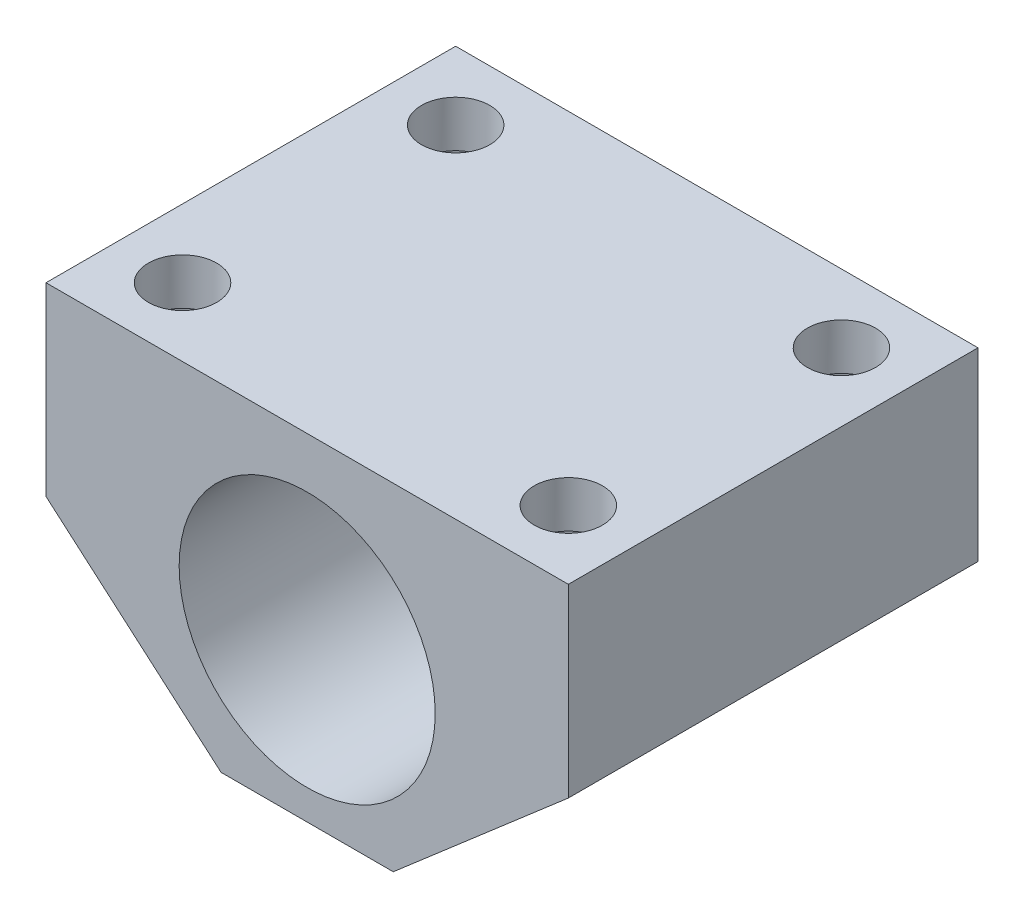
ISO-10303-21;
HEADER;
FILE_DESCRIPTION(('STEP AP214'),'2;1');
FILE_NAME('part.step','',(''),(''),'','','');
FILE_SCHEMA(('AUTOMOTIVE_DESIGN { 1 0 10303 214 1 1 1 1 }'));
ENDSEC;
DATA;
#1=APPLICATION_CONTEXT('core data for automotive mechanical design processes');
#2=APPLICATION_PROTOCOL_DEFINITION('international standard','automotive_design',2000,#1);
#3=PRODUCT_CONTEXT('',#1,'mechanical');
#4=PRODUCT('Part','Part','',(#3));
#5=PRODUCT_RELATED_PRODUCT_CATEGORY('part','',(#4));
#6=PRODUCT_DEFINITION_FORMATION('','',#4);
#7=PRODUCT_DEFINITION_CONTEXT('part definition',#1,'design');
#8=PRODUCT_DEFINITION('design','',#6,#7);
#9=PRODUCT_DEFINITION_SHAPE('','',#8);
#10=(LENGTH_UNIT() NAMED_UNIT(*) SI_UNIT(.MILLI.,.METRE.));
#11=(NAMED_UNIT(*) PLANE_ANGLE_UNIT() SI_UNIT($,.RADIAN.));
#12=(NAMED_UNIT(*) SI_UNIT($,.STERADIAN.) SOLID_ANGLE_UNIT());
#13=UNCERTAINTY_MEASURE_WITH_UNIT(LENGTH_MEASURE(1.E-05),#10,'distance_accuracy_value','');
#14=(GEOMETRIC_REPRESENTATION_CONTEXT(3) GLOBAL_UNCERTAINTY_ASSIGNED_CONTEXT((#13)) GLOBAL_UNIT_ASSIGNED_CONTEXT((#10,
#11,#12)) REPRESENTATION_CONTEXT('',''));
#15=CARTESIAN_POINT('',(0.,0.,0.));
#16=DIRECTION('',(0.,0.,1.));
#17=DIRECTION('',(1.,0.,0.));
#18=AXIS2_PLACEMENT_3D('',#15,#16,#17);
#19=CARTESIAN_POINT('',(-11.3009689771907,-9.24783839280759,-8.));
#20=DIRECTION('',(0.,1.,0.));
#21=DIRECTION('',(0.,0.,1.));
#22=AXIS2_PLACEMENT_3D('',#19,#20,#21);
#23=CYLINDRICAL_SURFACE('',#22,2.);
#24=CARTESIAN_POINT('',(-11.3009689771907,10.4668716354959,-8.));
#25=DIRECTION('',(0.,1.,0.));
#26=DIRECTION('',(0.,0.,1.));
#27=AXIS2_PLACEMENT_3D('',#24,#25,#26);
#28=CIRCLE('',#27,2.);
#29=CARTESIAN_POINT('',(-11.3009689771907,10.4668716354959,-6.));
#30=VERTEX_POINT('',#29);
#31=EDGE_CURVE('E126',#30,#30,#28,.T.);
#32=ORIENTED_EDGE('',*,*,#31,.T.);
#33=EDGE_LOOP('',(#32));
#34=FACE_BOUND('',#33,.T.);
#35=CARTESIAN_POINT('',(-11.3009689771907,7.75216160719241,-8.));
#36=DIRECTION('',(0.,-1.,0.));
#37=DIRECTION('',(0.,0.,-1.));
#38=AXIS2_PLACEMENT_3D('',#35,#36,#37);
#39=CIRCLE('',#38,2.);
#40=CARTESIAN_POINT('',(-11.3009689771907,7.75216160719241,-10.));
#41=VERTEX_POINT('',#40);
#42=EDGE_CURVE('E153',#41,#41,#39,.F.);
#43=ORIENTED_EDGE('',*,*,#42,.F.);
#44=EDGE_LOOP('',(#43));
#45=FACE_BOUND('',#44,.T.);
#46=ADVANCED_FACE('F35',(#34,#45),#23,.F.);
#47=CARTESIAN_POINT('',(-11.3009689771907,-9.24783839280759,8.));
#48=DIRECTION('',(0.,1.,0.));
#49=DIRECTION('',(0.,0.,1.));
#50=AXIS2_PLACEMENT_3D('',#47,#48,#49);
#51=CYLINDRICAL_SURFACE('',#50,2.);
#52=CARTESIAN_POINT('',(-11.3009689771907,10.4668716354959,8.));
#53=DIRECTION('',(0.,1.,0.));
#54=DIRECTION('',(0.,0.,1.));
#55=AXIS2_PLACEMENT_3D('',#52,#53,#54);
#56=CIRCLE('',#55,2.);
#57=CARTESIAN_POINT('',(-11.3009689771907,10.4668716354959,10.));
#58=VERTEX_POINT('',#57);
#59=EDGE_CURVE('E175',#58,#58,#56,.T.);
#60=ORIENTED_EDGE('',*,*,#59,.T.);
#61=EDGE_LOOP('',(#60));
#62=FACE_BOUND('',#61,.T.);
#63=CARTESIAN_POINT('',(-11.3009689771907,7.75216160719241,8.));
#64=DIRECTION('',(0.,-1.,0.));
#65=DIRECTION('',(0.,0.,-1.));
#66=AXIS2_PLACEMENT_3D('',#63,#64,#65);
#67=CIRCLE('',#66,2.);
#68=CARTESIAN_POINT('',(-11.3009689771907,7.75216160719241,6.));
#69=VERTEX_POINT('',#68);
#70=EDGE_CURVE('E150',#69,#69,#67,.F.);
#71=ORIENTED_EDGE('',*,*,#70,.F.);
#72=EDGE_LOOP('',(#71));
#73=FACE_BOUND('',#72,.T.);
#74=ADVANCED_FACE('F208',(#62,#73),#51,.F.);
#75=CARTESIAN_POINT('',(11.3009689771907,-9.24783839280759,8.));
#76=DIRECTION('',(0.,1.,0.));
#77=DIRECTION('',(0.,0.,1.));
#78=AXIS2_PLACEMENT_3D('',#75,#76,#77);
#79=CYLINDRICAL_SURFACE('',#78,2.);
#80=CARTESIAN_POINT('',(11.3009689771907,10.4668716354959,8.));
#81=DIRECTION('',(0.,1.,0.));
#82=DIRECTION('',(0.,0.,1.));
#83=AXIS2_PLACEMENT_3D('',#80,#81,#82);
#84=CIRCLE('',#83,2.);
#85=CARTESIAN_POINT('',(11.3009689771907,10.4668716354959,10.));
#86=VERTEX_POINT('',#85);
#87=EDGE_CURVE('E170',#86,#86,#84,.T.);
#88=ORIENTED_EDGE('',*,*,#87,.T.);
#89=EDGE_LOOP('',(#88));
#90=FACE_BOUND('',#89,.T.);
#91=CARTESIAN_POINT('',(11.3009689771907,7.75216160719241,8.));
#92=DIRECTION('',(0.,-1.,0.));
#93=DIRECTION('',(0.,0.,-1.));
#94=AXIS2_PLACEMENT_3D('',#91,#92,#93);
#95=CIRCLE('',#94,2.);
#96=CARTESIAN_POINT('',(11.3009689771907,7.75216160719241,6.));
#97=VERTEX_POINT('',#96);
#98=EDGE_CURVE('E146',#97,#97,#95,.F.);
#99=ORIENTED_EDGE('',*,*,#98,.F.);
#100=EDGE_LOOP('',(#99));
#101=FACE_BOUND('',#100,.T.);
#102=ADVANCED_FACE('F214',(#90,#101),#79,.F.);
#103=CARTESIAN_POINT('',(11.3009689771907,-9.24783839280759,-8.));
#104=DIRECTION('',(0.,1.,0.));
#105=DIRECTION('',(0.,0.,1.));
#106=AXIS2_PLACEMENT_3D('',#103,#104,#105);
#107=CYLINDRICAL_SURFACE('',#106,2.);
#108=CARTESIAN_POINT('',(11.3009689771907,10.4668716354959,-8.));
#109=DIRECTION('',(0.,1.,0.));
#110=DIRECTION('',(0.,0.,1.));
#111=AXIS2_PLACEMENT_3D('',#108,#109,#110);
#112=CIRCLE('',#111,2.);
#113=CARTESIAN_POINT('',(11.3009689771907,10.4668716354959,-6.));
#114=VERTEX_POINT('',#113);
#115=EDGE_CURVE('E166',#114,#114,#112,.T.);
#116=ORIENTED_EDGE('',*,*,#115,.T.);
#117=EDGE_LOOP('',(#116));
#118=FACE_BOUND('',#117,.T.);
#119=CARTESIAN_POINT('',(11.3009689771907,7.75216160719241,-8.));
#120=DIRECTION('',(0.,-1.,0.));
#121=DIRECTION('',(0.,0.,-1.));
#122=AXIS2_PLACEMENT_3D('',#119,#120,#121);
#123=CIRCLE('',#122,2.);
#124=CARTESIAN_POINT('',(11.3009689771907,7.75216160719241,-10.));
#125=VERTEX_POINT('',#124);
#126=EDGE_CURVE('E143',#125,#125,#123,.F.);
#127=ORIENTED_EDGE('',*,*,#126,.F.);
#128=EDGE_LOOP('',(#127));
#129=FACE_BOUND('',#128,.T.);
#130=ADVANCED_FACE('F219',(#118,#129),#107,.F.);
#131=CARTESIAN_POINT('',(-6.73373151994972,-7.78687436430205,12.));
#132=DIRECTION('',(0.654103999858189,0.756404625428427,0.));
#133=DIRECTION('',(-0.756404625428427,0.654103999858189,0.));
#134=AXIS2_PLACEMENT_3D('',#131,#132,#133);
#135=PLANE('',#134);
#136=CARTESIAN_POINT('',(-11.3009689771907,-3.83733705496657,8.));
#137=DIRECTION('',(0.654103999858189,0.756404625428427,0.));
#138=DIRECTION('',(0.756404625428427,-0.654103999858189,0.));
#139=AXIS2_PLACEMENT_3D('',#136,#137,#138);
#140=ELLIPSE('',#139,4.8915618382216,3.7);
#141=CARTESIAN_POINT('',(-7.60096897719075,-7.03692721890099,8.));
#142=VERTEX_POINT('',#141);
#143=EDGE_CURVE('E39',#142,#142,#140,.T.);
#144=ORIENTED_EDGE('',*,*,#143,.T.);
#145=EDGE_LOOP('',(#144));
#146=FACE_BOUND('',#145,.T.);
#147=CARTESIAN_POINT('',(-11.3009689771907,-3.83733705496657,-8.));
#148=DIRECTION('',(0.654103999858189,0.756404625428427,0.));
#149=DIRECTION('',(0.756404625428427,-0.654103999858189,0.));
#150=AXIS2_PLACEMENT_3D('',#147,#148,#149);
#151=ELLIPSE('',#150,4.8915618382216,3.7);
#152=CARTESIAN_POINT('',(-7.60096897719075,-7.03692721890099,-8.));
#153=VERTEX_POINT('',#152);
#154=EDGE_CURVE('E161',#153,#153,#151,.T.);
#155=ORIENTED_EDGE('',*,*,#154,.T.);
#156=EDGE_LOOP('',(#155));
#157=FACE_BOUND('',#156,.T.);
#158=DIRECTION('',(0.756404625428427,-0.654103999858188,0.));
#159=VECTOR('',#158,1.);
#160=CARTESIAN_POINT('',(-6.73373151994972,-7.78687436430205,-12.));
#161=LINE('',#160,#159);
#162=CARTESIAN_POINT('',(-15.3009689771907,-0.378320661523948,-12.));
#163=VERTEX_POINT('',#162);
#164=CARTESIAN_POINT('',(-5.04427548698596,-9.24783839280759,-12.));
#165=VERTEX_POINT('',#164);
#166=EDGE_CURVE('E125',#163,#165,#161,.T.);
#167=ORIENTED_EDGE('',*,*,#166,.T.);
#168=DIRECTION('',(0.,0.,-1.));
#169=VECTOR('',#168,1.);
#170=CARTESIAN_POINT('',(-5.04427548698596,-9.24783839280759,12.));
#171=LINE('',#170,#169);
#172=CARTESIAN_POINT('',(-5.04427548698596,-9.24783839280759,12.));
#173=VERTEX_POINT('',#172);
#174=EDGE_CURVE('E11',#173,#165,#171,.T.);
#175=ORIENTED_EDGE('',*,*,#174,.F.);
#176=DIRECTION('',(0.756404625428427,-0.654103999858188,0.));
#177=VECTOR('',#176,1.);
#178=CARTESIAN_POINT('',(-6.73373151994972,-7.78687436430205,12.));
#179=LINE('',#178,#177);
#180=CARTESIAN_POINT('',(-15.3009689771907,-0.378320661523948,12.));
#181=VERTEX_POINT('',#180);
#182=EDGE_CURVE('E183',#181,#173,#179,.T.);
#183=ORIENTED_EDGE('',*,*,#182,.F.);
#184=DIRECTION('',(0.,0.,-1.));
#185=VECTOR('',#184,1.);
#186=CARTESIAN_POINT('',(-15.3009689771907,-0.378320661523948,12.));
#187=LINE('',#186,#185);
#188=EDGE_CURVE('E121',#181,#163,#187,.T.);
#189=ORIENTED_EDGE('',*,*,#188,.T.);
#190=EDGE_LOOP('',(#167,#175,#183,#189));
#191=FACE_BOUND('',#190,.T.);
#192=ADVANCED_FACE('F194',(#146,#157,#191),#135,.F.);
#193=CARTESIAN_POINT('',(0.,-9.24783839280759,12.));
#194=DIRECTION('',(0.,1.,0.));
#195=DIRECTION('',(0.,0.,1.));
#196=AXIS2_PLACEMENT_3D('',#193,#194,#195);
#197=PLANE('',#196);
#198=DIRECTION('',(1.,0.,0.));
#199=VECTOR('',#198,1.);
#200=CARTESIAN_POINT('',(0.,-9.24783839280759,-12.));
#201=LINE('',#200,#199);
#202=CARTESIAN_POINT('',(5.04427548698596,-9.24783839280759,-12.));
#203=VERTEX_POINT('',#202);
#204=EDGE_CURVE('E129',#165,#203,#201,.T.);
#205=ORIENTED_EDGE('',*,*,#204,.T.);
#206=DIRECTION('',(0.,0.,-1.));
#207=VECTOR('',#206,1.);
#208=CARTESIAN_POINT('',(5.04427548698596,-9.24783839280759,12.));
#209=LINE('',#208,#207);
#210=CARTESIAN_POINT('',(5.04427548698596,-9.24783839280759,12.));
#211=VERTEX_POINT('',#210);
#212=EDGE_CURVE('E45',#211,#203,#209,.T.);
#213=ORIENTED_EDGE('',*,*,#212,.F.);
#214=DIRECTION('',(1.,0.,0.));
#215=VECTOR('',#214,1.);
#216=CARTESIAN_POINT('',(0.,-9.24783839280759,12.));
#217=LINE('',#216,#215);
#218=EDGE_CURVE('E90',#173,#211,#217,.T.);
#219=ORIENTED_EDGE('',*,*,#218,.F.);
#220=ORIENTED_EDGE('',*,*,#174,.T.);
#221=EDGE_LOOP('',(#205,#213,#219,#220));
#222=FACE_BOUND('',#221,.T.);
#223=ADVANCED_FACE('F186',(#222),#197,.F.);
#224=CARTESIAN_POINT('',(6.73373151994972,-7.78687436430205,12.));
#225=DIRECTION('',(0.654103999858188,-0.756404625428427,0.));
#226=DIRECTION('',(0.756404625428427,0.654103999858189,0.));
#227=AXIS2_PLACEMENT_3D('',#224,#225,#226);
#228=PLANE('',#227);
#229=CARTESIAN_POINT('',(11.3009689771907,-3.83733705496657,-8.));
#230=DIRECTION('',(0.654103999858188,-0.756404625428427,0.));
#231=DIRECTION('',(-0.756404625428427,-0.654103999858189,0.));
#232=AXIS2_PLACEMENT_3D('',#229,#230,#231);
#233=ELLIPSE('',#232,4.8915618382216,3.7);
#234=CARTESIAN_POINT('',(7.60096897719074,-7.03692721890099,-8.));
#235=VERTEX_POINT('',#234);
#236=EDGE_CURVE('E159',#235,#235,#233,.T.);
#237=ORIENTED_EDGE('',*,*,#236,.F.);
#238=EDGE_LOOP('',(#237));
#239=FACE_BOUND('',#238,.T.);
#240=CARTESIAN_POINT('',(11.3009689771907,-3.83733705496657,8.));
#241=DIRECTION('',(0.654103999858188,-0.756404625428427,0.));
#242=DIRECTION('',(-0.756404625428427,-0.654103999858189,0.));
#243=AXIS2_PLACEMENT_3D('',#240,#241,#242);
#244=ELLIPSE('',#243,4.8915618382216,3.7);
#245=CARTESIAN_POINT('',(7.60096897719074,-7.03692721890099,8.));
#246=VERTEX_POINT('',#245);
#247=EDGE_CURVE('E156',#246,#246,#244,.T.);
#248=ORIENTED_EDGE('',*,*,#247,.F.);
#249=EDGE_LOOP('',(#248));
#250=FACE_BOUND('',#249,.T.);
#251=DIRECTION('',(-0.756404625428427,-0.654103999858189,0.));
#252=VECTOR('',#251,1.);
#253=CARTESIAN_POINT('',(6.73373151994972,-7.78687436430205,-12.));
#254=LINE('',#253,#252);
#255=CARTESIAN_POINT('',(15.3009689771907,-0.378320661523949,-12.));
#256=VERTEX_POINT('',#255);
#257=EDGE_CURVE('E132',#256,#203,#254,.T.);
#258=ORIENTED_EDGE('',*,*,#257,.F.);
#259=DIRECTION('',(0.,0.,-1.));
#260=VECTOR('',#259,1.);
#261=CARTESIAN_POINT('',(15.3009689771907,-0.378320661523949,12.));
#262=LINE('',#261,#260);
#263=CARTESIAN_POINT('',(15.3009689771907,-0.378320661523949,12.));
#264=VERTEX_POINT('',#263);
#265=EDGE_CURVE('E106',#264,#256,#262,.T.);
#266=ORIENTED_EDGE('',*,*,#265,.F.);
#267=DIRECTION('',(-0.756404625428427,-0.654103999858189,0.));
#268=VECTOR('',#267,1.);
#269=CARTESIAN_POINT('',(6.73373151994972,-7.78687436430205,12.));
#270=LINE('',#269,#268);
#271=EDGE_CURVE('E115',#264,#211,#270,.T.);
#272=ORIENTED_EDGE('',*,*,#271,.T.);
#273=ORIENTED_EDGE('',*,*,#212,.T.);
#274=EDGE_LOOP('',(#258,#266,#272,#273));
#275=FACE_BOUND('',#274,.T.);
#276=ADVANCED_FACE('F189',(#239,#250,#275),#228,.T.);
#277=CARTESIAN_POINT('',(15.3009689771907,0.,12.));
#278=DIRECTION('',(1.,0.,0.));
#279=DIRECTION('',(0.,0.,-1.));
#280=AXIS2_PLACEMENT_3D('',#277,#278,#279);
#281=PLANE('',#280);
#282=DIRECTION('',(0.,-1.,0.));
#283=VECTOR('',#282,1.);
#284=CARTESIAN_POINT('',(15.3009689771907,0.,-12.));
#285=LINE('',#284,#283);
#286=CARTESIAN_POINT('',(15.3009689771907,10.4668716354959,-12.));
#287=VERTEX_POINT('',#286);
#288=EDGE_CURVE('E105',#287,#256,#285,.T.);
#289=ORIENTED_EDGE('',*,*,#288,.F.);
#290=DIRECTION('',(0.,0.,-1.));
#291=VECTOR('',#290,1.);
#292=CARTESIAN_POINT('',(15.3009689771907,10.4668716354959,12.));
#293=LINE('',#292,#291);
#294=CARTESIAN_POINT('',(15.3009689771907,10.4668716354959,12.));
#295=VERTEX_POINT('',#294);
#296=EDGE_CURVE('E99',#295,#287,#293,.T.);
#297=ORIENTED_EDGE('',*,*,#296,.F.);
#298=DIRECTION('',(0.,-1.,0.));
#299=VECTOR('',#298,1.);
#300=CARTESIAN_POINT('',(15.3009689771907,0.,12.));
#301=LINE('',#300,#299);
#302=EDGE_CURVE('E103',#295,#264,#301,.T.);
#303=ORIENTED_EDGE('',*,*,#302,.T.);
#304=ORIENTED_EDGE('',*,*,#265,.T.);
#305=EDGE_LOOP('',(#289,#297,#303,#304));
#306=FACE_BOUND('',#305,.T.);
#307=ADVANCED_FACE('F101',(#306),#281,.T.);
#308=CARTESIAN_POINT('',(0.,10.4668716354959,12.));
#309=DIRECTION('',(0.,-1.,0.));
#310=DIRECTION('',(0.,0.,-1.));
#311=AXIS2_PLACEMENT_3D('',#308,#309,#310);
#312=PLANE('',#311);
#313=ORIENTED_EDGE('',*,*,#115,.F.);
#314=EDGE_LOOP('',(#313));
#315=FACE_BOUND('',#314,.T.);
#316=ORIENTED_EDGE('',*,*,#87,.F.);
#317=EDGE_LOOP('',(#316));
#318=FACE_BOUND('',#317,.T.);
#319=ORIENTED_EDGE('',*,*,#59,.F.);
#320=EDGE_LOOP('',(#319));
#321=FACE_BOUND('',#320,.T.);
#322=ORIENTED_EDGE('',*,*,#31,.F.);
#323=EDGE_LOOP('',(#322));
#324=FACE_BOUND('',#323,.T.);
#325=DIRECTION('',(-1.,0.,0.));
#326=VECTOR('',#325,1.);
#327=CARTESIAN_POINT('',(0.,10.4668716354959,-12.));
#328=LINE('',#327,#326);
#329=CARTESIAN_POINT('',(-15.3009689771907,10.4668716354959,-12.));
#330=VERTEX_POINT('',#329);
#331=EDGE_CURVE('E76',#287,#330,#328,.T.);
#332=ORIENTED_EDGE('',*,*,#331,.T.);
#333=DIRECTION('',(0.,0.,-1.));
#334=VECTOR('',#333,1.);
#335=CARTESIAN_POINT('',(-15.3009689771907,10.4668716354959,12.));
#336=LINE('',#335,#334);
#337=CARTESIAN_POINT('',(-15.3009689771907,10.4668716354959,12.));
#338=VERTEX_POINT('',#337);
#339=EDGE_CURVE('E107',#338,#330,#336,.T.);
#340=ORIENTED_EDGE('',*,*,#339,.F.);
#341=DIRECTION('',(-1.,0.,0.));
#342=VECTOR('',#341,1.);
#343=CARTESIAN_POINT('',(0.,10.4668716354959,12.));
#344=LINE('',#343,#342);
#345=EDGE_CURVE('E109',#295,#338,#344,.T.);
#346=ORIENTED_EDGE('',*,*,#345,.F.);
#347=ORIENTED_EDGE('',*,*,#296,.T.);
#348=EDGE_LOOP('',(#332,#340,#346,#347));
#349=FACE_BOUND('',#348,.T.);
#350=ADVANCED_FACE('F110',(#315,#318,#321,#324,#349),#312,.F.);
#351=CARTESIAN_POINT('',(0.,0.,12.));
#352=DIRECTION('',(0.,0.,-1.));
#353=DIRECTION('',(-1.,0.,0.));
#354=AXIS2_PLACEMENT_3D('',#351,#352,#353);
#355=CYLINDRICAL_SURFACE('',#354,7.5);
#356=CARTESIAN_POINT('',(0.,0.,12.));
#357=DIRECTION('',(0.,0.,1.));
#358=DIRECTION('',(1.,0.,0.));
#359=AXIS2_PLACEMENT_3D('',#356,#357,#358);
#360=CIRCLE('',#359,7.5);
#361=CARTESIAN_POINT('',(7.5,0.,12.));
#362=VERTEX_POINT('',#361);
#363=EDGE_CURVE('E138',#362,#362,#360,.T.);
#364=ORIENTED_EDGE('',*,*,#363,.T.);
#365=EDGE_LOOP('',(#364));
#366=FACE_BOUND('',#365,.T.);
#367=CARTESIAN_POINT('',(0.,0.,-12.));
#368=DIRECTION('',(0.,0.,1.));
#369=DIRECTION('',(1.,0.,0.));
#370=AXIS2_PLACEMENT_3D('',#367,#368,#369);
#371=CIRCLE('',#370,7.5);
#372=CARTESIAN_POINT('',(7.5,0.,-12.));
#373=VERTEX_POINT('',#372);
#374=EDGE_CURVE('E122',#373,#373,#371,.T.);
#375=ORIENTED_EDGE('',*,*,#374,.F.);
#376=EDGE_LOOP('',(#375));
#377=FACE_BOUND('',#376,.T.);
#378=ADVANCED_FACE('F37',(#366,#377),#355,.F.);
#379=CARTESIAN_POINT('',(-15.3009689771907,0.,12.));
#380=DIRECTION('',(1.,0.,0.));
#381=DIRECTION('',(0.,0.,-1.));
#382=AXIS2_PLACEMENT_3D('',#379,#380,#381);
#383=PLANE('',#382);
#384=DIRECTION('',(0.,-1.,0.));
#385=VECTOR('',#384,1.);
#386=CARTESIAN_POINT('',(-15.3009689771907,0.,-12.));
#387=LINE('',#386,#385);
#388=EDGE_CURVE('E82',#330,#163,#387,.T.);
#389=ORIENTED_EDGE('',*,*,#388,.T.);
#390=ORIENTED_EDGE('',*,*,#188,.F.);
#391=DIRECTION('',(0.,-1.,0.));
#392=VECTOR('',#391,1.);
#393=CARTESIAN_POINT('',(-15.3009689771907,0.,12.));
#394=LINE('',#393,#392);
#395=EDGE_CURVE('E54',#338,#181,#394,.T.);
#396=ORIENTED_EDGE('',*,*,#395,.F.);
#397=ORIENTED_EDGE('',*,*,#339,.T.);
#398=EDGE_LOOP('',(#389,#390,#396,#397));
#399=FACE_BOUND('',#398,.T.);
#400=ADVANCED_FACE('F195',(#399),#383,.F.);
#401=CARTESIAN_POINT('',(0.,0.,12.));
#402=DIRECTION('',(0.,0.,1.));
#403=DIRECTION('',(1.,0.,0.));
#404=AXIS2_PLACEMENT_3D('',#401,#402,#403);
#405=PLANE('',#404);
#406=ORIENTED_EDGE('',*,*,#363,.F.);
#407=EDGE_LOOP('',(#406));
#408=FACE_BOUND('',#407,.T.);
#409=ORIENTED_EDGE('',*,*,#182,.T.);
#410=ORIENTED_EDGE('',*,*,#218,.T.);
#411=ORIENTED_EDGE('',*,*,#271,.F.);
#412=ORIENTED_EDGE('',*,*,#302,.F.);
#413=ORIENTED_EDGE('',*,*,#345,.T.);
#414=ORIENTED_EDGE('',*,*,#395,.T.);
#415=EDGE_LOOP('',(#409,#410,#411,#412,#413,#414));
#416=FACE_BOUND('',#415,.T.);
#417=ADVANCED_FACE('F113',(#408,#416),#405,.T.);
#418=CARTESIAN_POINT('',(0.,0.,-12.));
#419=DIRECTION('',(0.,0.,1.));
#420=DIRECTION('',(1.,0.,0.));
#421=AXIS2_PLACEMENT_3D('',#418,#419,#420);
#422=PLANE('',#421);
#423=ORIENTED_EDGE('',*,*,#374,.T.);
#424=EDGE_LOOP('',(#423));
#425=FACE_BOUND('',#424,.T.);
#426=ORIENTED_EDGE('',*,*,#166,.F.);
#427=ORIENTED_EDGE('',*,*,#388,.F.);
#428=ORIENTED_EDGE('',*,*,#331,.F.);
#429=ORIENTED_EDGE('',*,*,#288,.T.);
#430=ORIENTED_EDGE('',*,*,#257,.T.);
#431=ORIENTED_EDGE('',*,*,#204,.F.);
#432=EDGE_LOOP('',(#426,#427,#428,#429,#430,#431));
#433=FACE_BOUND('',#432,.T.);
#434=ADVANCED_FACE('F192',(#425,#433),#422,.F.);
#435=CARTESIAN_POINT('',(11.3009689771907,7.7521616071924,-8.));
#436=DIRECTION('',(0.,-1.,0.));
#437=DIRECTION('',(0.,0.,-1.));
#438=AXIS2_PLACEMENT_3D('',#435,#436,#437);
#439=PLANE('',#438);
#440=CARTESIAN_POINT('',(11.3009689771907,7.7521616071924,-8.));
#441=DIRECTION('',(0.,-1.,0.));
#442=DIRECTION('',(0.,0.,-1.));
#443=AXIS2_PLACEMENT_3D('',#440,#441,#442);
#444=CIRCLE('',#443,3.7);
#445=CARTESIAN_POINT('',(11.3009689771907,7.7521616071924,-11.7));
#446=VERTEX_POINT('',#445);
#447=EDGE_CURVE('E278',#446,#446,#444,.T.);
#448=ORIENTED_EDGE('',*,*,#447,.T.);
#449=EDGE_LOOP('',(#448));
#450=FACE_BOUND('',#449,.T.);
#451=ORIENTED_EDGE('',*,*,#126,.T.);
#452=EDGE_LOOP('',(#451));
#453=FACE_BOUND('',#452,.T.);
#454=ADVANCED_FACE('F222',(#450,#453),#439,.T.);
#455=CARTESIAN_POINT('',(11.3009689771907,7.7521616071924,-8.));
#456=DIRECTION('',(0.,-1.,0.));
#457=DIRECTION('',(0.,0.,-1.));
#458=AXIS2_PLACEMENT_3D('',#455,#456,#457);
#459=CYLINDRICAL_SURFACE('',#458,3.7);
#460=ORIENTED_EDGE('',*,*,#236,.T.);
#461=EDGE_LOOP('',(#460));
#462=FACE_BOUND('',#461,.T.);
#463=ORIENTED_EDGE('',*,*,#447,.F.);
#464=EDGE_LOOP('',(#463));
#465=FACE_BOUND('',#464,.T.);
#466=ADVANCED_FACE('F227',(#462,#465),#459,.F.);
#467=CARTESIAN_POINT('',(11.3009689771907,7.7521616071924,8.));
#468=DIRECTION('',(0.,-1.,0.));
#469=DIRECTION('',(0.,0.,-1.));
#470=AXIS2_PLACEMENT_3D('',#467,#468,#469);
#471=PLANE('',#470);
#472=CARTESIAN_POINT('',(11.3009689771907,7.7521616071924,8.));
#473=DIRECTION('',(0.,-1.,0.));
#474=DIRECTION('',(0.,0.,-1.));
#475=AXIS2_PLACEMENT_3D('',#472,#473,#474);
#476=CIRCLE('',#475,3.7);
#477=CARTESIAN_POINT('',(11.3009689771907,7.7521616071924,4.3));
#478=VERTEX_POINT('',#477);
#479=EDGE_CURVE('E276',#478,#478,#476,.T.);
#480=ORIENTED_EDGE('',*,*,#479,.T.);
#481=EDGE_LOOP('',(#480));
#482=FACE_BOUND('',#481,.T.);
#483=ORIENTED_EDGE('',*,*,#98,.T.);
#484=EDGE_LOOP('',(#483));
#485=FACE_BOUND('',#484,.T.);
#486=ADVANCED_FACE('F235',(#482,#485),#471,.T.);
#487=CARTESIAN_POINT('',(11.3009689771907,7.7521616071924,8.));
#488=DIRECTION('',(0.,-1.,0.));
#489=DIRECTION('',(0.,0.,-1.));
#490=AXIS2_PLACEMENT_3D('',#487,#488,#489);
#491=CYLINDRICAL_SURFACE('',#490,3.7);
#492=ORIENTED_EDGE('',*,*,#247,.T.);
#493=EDGE_LOOP('',(#492));
#494=FACE_BOUND('',#493,.T.);
#495=ORIENTED_EDGE('',*,*,#479,.F.);
#496=EDGE_LOOP('',(#495));
#497=FACE_BOUND('',#496,.T.);
#498=ADVANCED_FACE('F241',(#494,#497),#491,.F.);
#499=CARTESIAN_POINT('',(-11.3009689771907,7.7521616071924,8.));
#500=DIRECTION('',(0.,-1.,0.));
#501=DIRECTION('',(0.,0.,-1.));
#502=AXIS2_PLACEMENT_3D('',#499,#500,#501);
#503=CYLINDRICAL_SURFACE('',#502,3.7);
#504=CARTESIAN_POINT('',(-11.3009689771907,7.7521616071924,8.));
#505=DIRECTION('',(0.,-1.,0.));
#506=DIRECTION('',(0.,0.,-1.));
#507=AXIS2_PLACEMENT_3D('',#504,#505,#506);
#508=CIRCLE('',#507,3.7);
#509=CARTESIAN_POINT('',(-11.3009689771907,7.7521616071924,4.3));
#510=VERTEX_POINT('',#509);
#511=EDGE_CURVE('E282',#510,#510,#508,.T.);
#512=ORIENTED_EDGE('',*,*,#511,.F.);
#513=EDGE_LOOP('',(#512));
#514=FACE_BOUND('',#513,.T.);
#515=ORIENTED_EDGE('',*,*,#143,.F.);
#516=EDGE_LOOP('',(#515));
#517=FACE_BOUND('',#516,.T.);
#518=ADVANCED_FACE('F248',(#514,#517),#503,.F.);
#519=CARTESIAN_POINT('',(-11.3009689771907,7.7521616071924,8.));
#520=DIRECTION('',(0.,-1.,0.));
#521=DIRECTION('',(0.,0.,-1.));
#522=AXIS2_PLACEMENT_3D('',#519,#520,#521);
#523=PLANE('',#522);
#524=ORIENTED_EDGE('',*,*,#511,.T.);
#525=EDGE_LOOP('',(#524));
#526=FACE_BOUND('',#525,.T.);
#527=ORIENTED_EDGE('',*,*,#70,.T.);
#528=EDGE_LOOP('',(#527));
#529=FACE_BOUND('',#528,.T.);
#530=ADVANCED_FACE('F244',(#526,#529),#523,.T.);
#531=CARTESIAN_POINT('',(-11.3009689771907,7.7521616071924,-8.));
#532=DIRECTION('',(0.,-1.,0.));
#533=DIRECTION('',(0.,0.,-1.));
#534=AXIS2_PLACEMENT_3D('',#531,#532,#533);
#535=CYLINDRICAL_SURFACE('',#534,3.7);
#536=CARTESIAN_POINT('',(-11.3009689771907,7.7521616071924,-8.));
#537=DIRECTION('',(0.,-1.,0.));
#538=DIRECTION('',(0.,0.,-1.));
#539=AXIS2_PLACEMENT_3D('',#536,#537,#538);
#540=CIRCLE('',#539,3.7);
#541=CARTESIAN_POINT('',(-11.3009689771907,7.7521616071924,-11.7));
#542=VERTEX_POINT('',#541);
#543=EDGE_CURVE('E147',#542,#542,#540,.T.);
#544=ORIENTED_EDGE('',*,*,#543,.F.);
#545=EDGE_LOOP('',(#544));
#546=FACE_BOUND('',#545,.T.);
#547=ORIENTED_EDGE('',*,*,#154,.F.);
#548=EDGE_LOOP('',(#547));
#549=FACE_BOUND('',#548,.T.);
#550=ADVANCED_FACE('F247',(#546,#549),#535,.F.);
#551=CARTESIAN_POINT('',(-11.3009689771907,7.7521616071924,-8.));
#552=DIRECTION('',(0.,-1.,0.));
#553=DIRECTION('',(0.,0.,-1.));
#554=AXIS2_PLACEMENT_3D('',#551,#552,#553);
#555=PLANE('',#554);
#556=ORIENTED_EDGE('',*,*,#543,.T.);
#557=EDGE_LOOP('',(#556));
#558=FACE_BOUND('',#557,.T.);
#559=ORIENTED_EDGE('',*,*,#42,.T.);
#560=EDGE_LOOP('',(#559));
#561=FACE_BOUND('',#560,.T.);
#562=ADVANCED_FACE('F253',(#558,#561),#555,.T.);
#563=CLOSED_SHELL('',(#46,#74,#102,#130,#192,#223,#276,#307,#350,#378,#400,#417,#434,#454,#466,
#486,#498,#518,#530,#550,#562));
#564=MANIFOLD_SOLID_BREP('B2',#563);
#565=ADVANCED_BREP_SHAPE_REPRESENTATION('',(#18,#564),#14);
#566=SHAPE_DEFINITION_REPRESENTATION(#9,#565);
ENDSEC;
END-ISO-10303-21;
